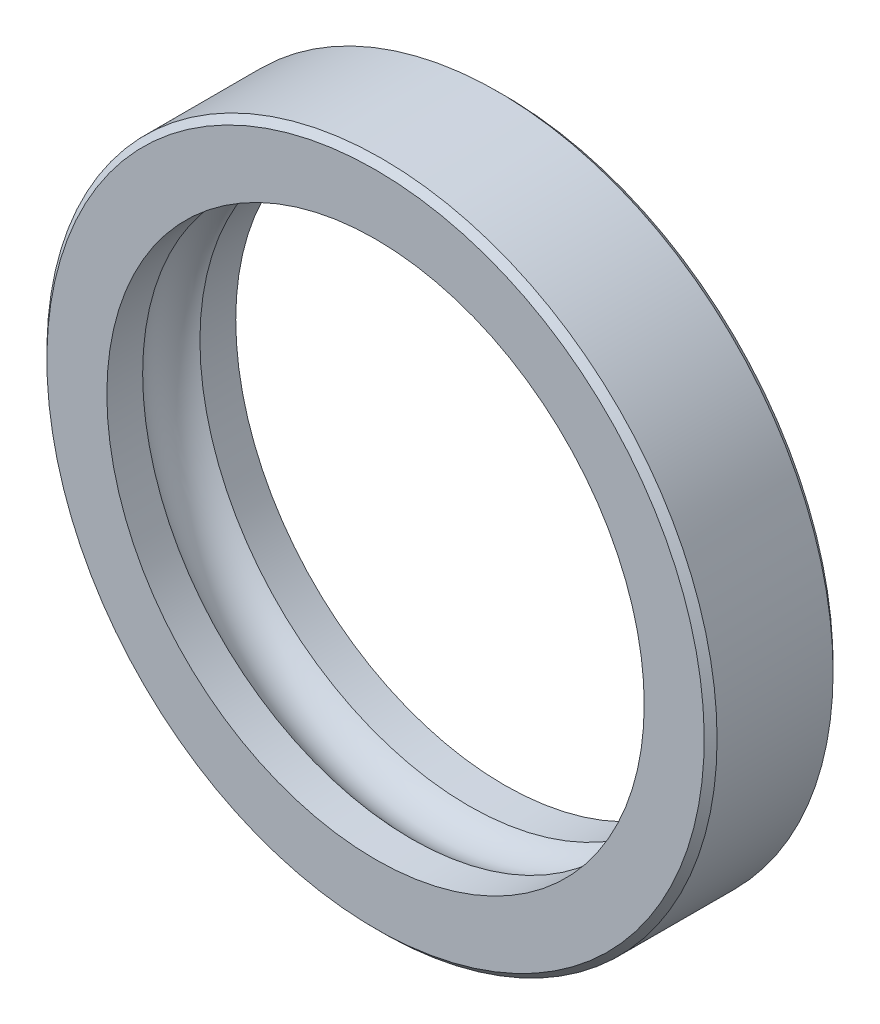
ISO-10303-21;
HEADER;
FILE_DESCRIPTION(('STEP AP214'),'2;1');
FILE_NAME('part.step','',(''),(''),'','','');
FILE_SCHEMA(('AUTOMOTIVE_DESIGN { 1 0 10303 214 1 1 1 1 }'));
ENDSEC;
DATA;
#1=APPLICATION_CONTEXT('core data for automotive mechanical design processes');
#2=APPLICATION_PROTOCOL_DEFINITION('international standard','automotive_design',2000,#1);
#3=PRODUCT_CONTEXT('',#1,'mechanical');
#4=PRODUCT('Part','Part','',(#3));
#5=PRODUCT_RELATED_PRODUCT_CATEGORY('part','',(#4));
#6=PRODUCT_DEFINITION_FORMATION('','',#4);
#7=PRODUCT_DEFINITION_CONTEXT('part definition',#1,'design');
#8=PRODUCT_DEFINITION('design','',#6,#7);
#9=PRODUCT_DEFINITION_SHAPE('','',#8);
#10=(LENGTH_UNIT() NAMED_UNIT(*) SI_UNIT(.MILLI.,.METRE.));
#11=(NAMED_UNIT(*) PLANE_ANGLE_UNIT() SI_UNIT($,.RADIAN.));
#12=(NAMED_UNIT(*) SI_UNIT($,.STERADIAN.) SOLID_ANGLE_UNIT());
#13=UNCERTAINTY_MEASURE_WITH_UNIT(LENGTH_MEASURE(1.E-05),#10,'distance_accuracy_value','');
#14=(GEOMETRIC_REPRESENTATION_CONTEXT(3) GLOBAL_UNCERTAINTY_ASSIGNED_CONTEXT((#13)) GLOBAL_UNIT_ASSIGNED_CONTEXT((#10,
#11,#12)) REPRESENTATION_CONTEXT('',''));
#15=CARTESIAN_POINT('',(0.,0.,0.));
#16=DIRECTION('',(0.,0.,1.));
#17=DIRECTION('',(1.,0.,0.));
#18=AXIS2_PLACEMENT_3D('',#15,#16,#17);
#19=CARTESIAN_POINT('',(0.,0.,0.));
#20=DIRECTION('',(0.,0.,1.));
#21=DIRECTION('',(1.,0.,0.));
#22=AXIS2_PLACEMENT_3D('',#19,#20,#21);
#23=TOROIDAL_SURFACE('',#22,15.08125,2.29317598176668);
#24=CARTESIAN_POINT('',(0.,0.,1.76388888888889));
#25=DIRECTION('',(0.,0.,1.));
#26=DIRECTION('',(1.,0.,0.));
#27=AXIS2_PLACEMENT_3D('',#24,#25,#26);
#28=CIRCLE('',#27,16.5466346153846);
#29=CARTESIAN_POINT('',(16.5466346153846,0.,1.76388888888889));
#30=VERTEX_POINT('',#29);
#31=EDGE_CURVE('E32',#30,#30,#28,.T.);
#32=ORIENTED_EDGE('',*,*,#31,.T.);
#33=EDGE_LOOP('',(#32));
#34=FACE_BOUND('',#33,.T.);
#35=CARTESIAN_POINT('',(0.,0.,-1.76388888888889));
#36=DIRECTION('',(0.,0.,1.));
#37=DIRECTION('',(1.,0.,0.));
#38=AXIS2_PLACEMENT_3D('',#35,#36,#37);
#39=CIRCLE('',#38,16.5466346153846);
#40=CARTESIAN_POINT('',(16.5466346153846,0.,-1.76388888888889));
#41=VERTEX_POINT('',#40);
#42=EDGE_CURVE('E30',#41,#41,#39,.F.);
#43=ORIENTED_EDGE('',*,*,#42,.T.);
#44=EDGE_LOOP('',(#43));
#45=FACE_BOUND('',#44,.T.);
#46=ADVANCED_FACE('F14',(#34,#45),#23,.F.);
#47=CARTESIAN_POINT('',(0.,0.,3.96875));
#48=DIRECTION('',(0.,0.,1.));
#49=DIRECTION('',(1.,0.,0.));
#50=AXIS2_PLACEMENT_3D('',#47,#48,#49);
#51=CYLINDRICAL_SURFACE('',#50,16.5466346153846);
#52=CARTESIAN_POINT('',(0.,0.,3.96875));
#53=DIRECTION('',(0.,0.,1.));
#54=DIRECTION('',(1.,0.,0.));
#55=AXIS2_PLACEMENT_3D('',#52,#53,#54);
#56=CIRCLE('',#55,16.5466346153846);
#57=CARTESIAN_POINT('',(16.5466346153846,0.,3.96875));
#58=VERTEX_POINT('',#57);
#59=EDGE_CURVE('E18',#58,#58,#56,.T.);
#60=ORIENTED_EDGE('',*,*,#59,.T.);
#61=EDGE_LOOP('',(#60));
#62=FACE_BOUND('',#61,.T.);
#63=ORIENTED_EDGE('',*,*,#31,.F.);
#64=EDGE_LOOP('',(#63));
#65=FACE_BOUND('',#64,.T.);
#66=ADVANCED_FACE('F48',(#62,#65),#51,.F.);
#67=CARTESIAN_POINT('',(0.,0.,3.96875));
#68=DIRECTION('',(0.,0.,1.));
#69=DIRECTION('',(1.,0.,0.));
#70=AXIS2_PLACEMENT_3D('',#67,#68,#69);
#71=CYLINDRICAL_SURFACE('',#70,16.5466346153846);
#72=ORIENTED_EDGE('',*,*,#42,.F.);
#73=EDGE_LOOP('',(#72));
#74=FACE_BOUND('',#73,.T.);
#75=CARTESIAN_POINT('',(0.,0.,-3.96875));
#76=DIRECTION('',(0.,0.,1.));
#77=DIRECTION('',(1.,0.,0.));
#78=AXIS2_PLACEMENT_3D('',#75,#76,#77);
#79=CIRCLE('',#78,16.5466346153846);
#80=CARTESIAN_POINT('',(16.5466346153846,0.,-3.96875));
#81=VERTEX_POINT('',#80);
#82=EDGE_CURVE('E41',#81,#81,#79,.F.);
#83=ORIENTED_EDGE('',*,*,#82,.T.);
#84=EDGE_LOOP('',(#83));
#85=FACE_BOUND('',#84,.T.);
#86=ADVANCED_FACE('F55',(#74,#85),#71,.F.);
#87=CARTESIAN_POINT('',(0.,20.240625,3.96875));
#88=DIRECTION('',(0.,0.,-1.));
#89=DIRECTION('',(-1.,0.,0.));
#90=AXIS2_PLACEMENT_3D('',#87,#88,#89);
#91=PLANE('',#90);
#92=ORIENTED_EDGE('',*,*,#59,.F.);
#93=EDGE_LOOP('',(#92));
#94=FACE_BOUND('',#93,.T.);
#95=CARTESIAN_POINT('',(0.,0.,3.96875));
#96=DIRECTION('',(0.,0.,-1.));
#97=DIRECTION('',(0.,1.,0.));
#98=AXIS2_PLACEMENT_3D('',#95,#96,#97);
#99=CIRCLE('',#98,20.240625);
#100=CARTESIAN_POINT('',(0.,20.240625,3.96875));
#101=VERTEX_POINT('',#100);
#102=EDGE_CURVE('E39',#101,#101,#99,.T.);
#103=ORIENTED_EDGE('',*,*,#102,.F.);
#104=EDGE_LOOP('',(#103));
#105=FACE_BOUND('',#104,.T.);
#106=ADVANCED_FACE('F51',(#94,#105),#91,.F.);
#107=CARTESIAN_POINT('',(0.,20.240625,-3.96875));
#108=DIRECTION('',(0.,0.,1.));
#109=DIRECTION('',(1.,0.,0.));
#110=AXIS2_PLACEMENT_3D('',#107,#108,#109);
#111=PLANE('',#110);
#112=ORIENTED_EDGE('',*,*,#82,.F.);
#113=EDGE_LOOP('',(#112));
#114=FACE_BOUND('',#113,.T.);
#115=CARTESIAN_POINT('',(0.,0.,-3.96875));
#116=DIRECTION('',(0.,0.,1.));
#117=DIRECTION('',(0.,-1.,0.));
#118=AXIS2_PLACEMENT_3D('',#115,#116,#117);
#119=CIRCLE('',#118,20.240625);
#120=CARTESIAN_POINT('',(0.,-20.240625,-3.96875));
#121=VERTEX_POINT('',#120);
#122=EDGE_CURVE('E27',#121,#121,#119,.T.);
#123=ORIENTED_EDGE('',*,*,#122,.F.);
#124=EDGE_LOOP('',(#123));
#125=FACE_BOUND('',#124,.T.);
#126=ADVANCED_FACE('F54',(#114,#125),#111,.F.);
#127=CARTESIAN_POINT('',(0.,0.,3.571875));
#128=DIRECTION('',(0.,0.,-1.));
#129=DIRECTION('',(0.,1.,0.));
#130=AXIS2_PLACEMENT_3D('',#127,#128,#129);
#131=CONICAL_SURFACE('',#130,20.6375,0.785398163397441);
#132=CARTESIAN_POINT('',(0.,0.,3.571875));
#133=DIRECTION('',(0.,0.,1.));
#134=DIRECTION('',(1.,0.,0.));
#135=AXIS2_PLACEMENT_3D('',#132,#133,#134);
#136=CIRCLE('',#135,20.6375);
#137=CARTESIAN_POINT('',(20.6375,0.,3.571875));
#138=VERTEX_POINT('',#137);
#139=EDGE_CURVE('E22',#138,#138,#136,.F.);
#140=ORIENTED_EDGE('',*,*,#139,.F.);
#141=EDGE_LOOP('',(#140));
#142=FACE_BOUND('',#141,.T.);
#143=ORIENTED_EDGE('',*,*,#102,.T.);
#144=EDGE_LOOP('',(#143));
#145=FACE_BOUND('',#144,.T.);
#146=ADVANCED_FACE('F59',(#142,#145),#131,.T.);
#147=CARTESIAN_POINT('',(0.,0.,-3.571875));
#148=DIRECTION('',(0.,0.,1.));
#149=DIRECTION('',(0.,-1.,0.));
#150=AXIS2_PLACEMENT_3D('',#147,#148,#149);
#151=CONICAL_SURFACE('',#150,20.6375,0.785398163397441);
#152=CARTESIAN_POINT('',(0.,0.,-3.571875));
#153=DIRECTION('',(0.,0.,1.));
#154=DIRECTION('',(1.,0.,0.));
#155=AXIS2_PLACEMENT_3D('',#152,#153,#154);
#156=CIRCLE('',#155,20.6375);
#157=CARTESIAN_POINT('',(20.6375,0.,-3.571875));
#158=VERTEX_POINT('',#157);
#159=EDGE_CURVE('E10',#158,#158,#156,.T.);
#160=ORIENTED_EDGE('',*,*,#159,.F.);
#161=EDGE_LOOP('',(#160));
#162=FACE_BOUND('',#161,.T.);
#163=ORIENTED_EDGE('',*,*,#122,.T.);
#164=EDGE_LOOP('',(#163));
#165=FACE_BOUND('',#164,.T.);
#166=ADVANCED_FACE('F61',(#162,#165),#151,.T.);
#167=CARTESIAN_POINT('',(0.,0.,3.96875));
#168=DIRECTION('',(0.,0.,1.));
#169=DIRECTION('',(1.,0.,0.));
#170=AXIS2_PLACEMENT_3D('',#167,#168,#169);
#171=CYLINDRICAL_SURFACE('',#170,20.6375);
#172=ORIENTED_EDGE('',*,*,#139,.T.);
#173=EDGE_LOOP('',(#172));
#174=FACE_BOUND('',#173,.T.);
#175=ORIENTED_EDGE('',*,*,#159,.T.);
#176=EDGE_LOOP('',(#175));
#177=FACE_BOUND('',#176,.T.);
#178=ADVANCED_FACE('F69',(#174,#177),#171,.T.);
#179=CLOSED_SHELL('',(#46,#66,#86,#106,#126,#146,#166,#178));
#180=MANIFOLD_SOLID_BREP('B1',#179);
#181=ADVANCED_BREP_SHAPE_REPRESENTATION('',(#18,#180),#14);
#182=SHAPE_DEFINITION_REPRESENTATION(#9,#181);
ENDSEC;
END-ISO-10303-21;
